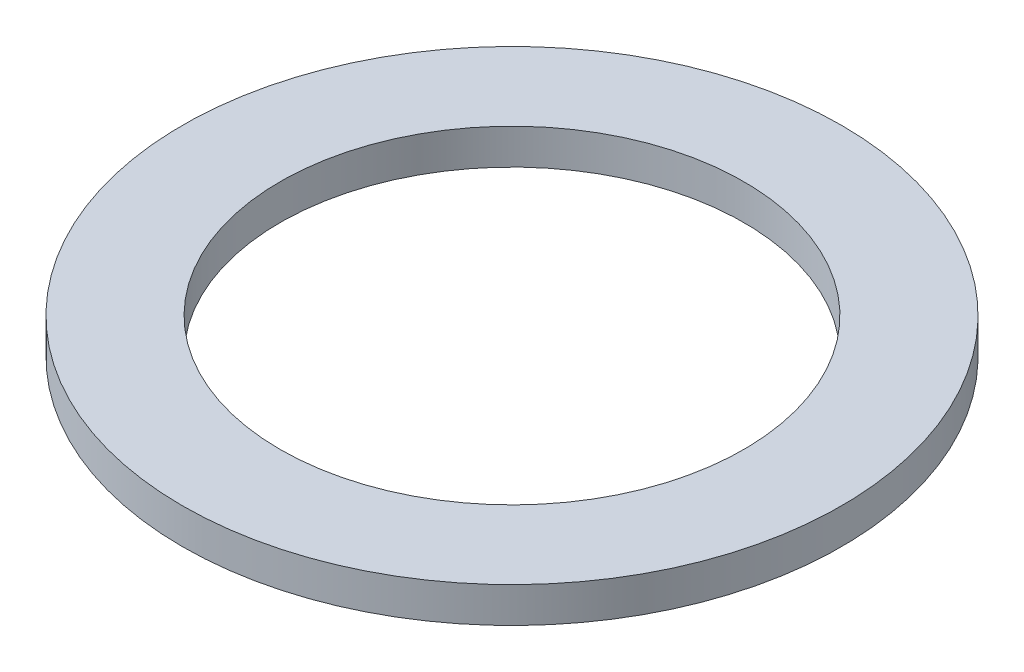
ISO-10303-21;
HEADER;
FILE_DESCRIPTION(('STEP AP214'),'2;1');
FILE_NAME('part.step','',(''),(''),'','','');
FILE_SCHEMA(('AUTOMOTIVE_DESIGN { 1 0 10303 214 1 1 1 1 }'));
ENDSEC;
DATA;
#1=APPLICATION_CONTEXT('core data for automotive mechanical design processes');
#2=APPLICATION_PROTOCOL_DEFINITION('international standard','automotive_design',2000,#1);
#3=PRODUCT_CONTEXT('',#1,'mechanical');
#4=PRODUCT('Part','Part','',(#3));
#5=PRODUCT_RELATED_PRODUCT_CATEGORY('part','',(#4));
#6=PRODUCT_DEFINITION_FORMATION('','',#4);
#7=PRODUCT_DEFINITION_CONTEXT('part definition',#1,'design');
#8=PRODUCT_DEFINITION('design','',#6,#7);
#9=PRODUCT_DEFINITION_SHAPE('','',#8);
#10=(LENGTH_UNIT() NAMED_UNIT(*) SI_UNIT(.MILLI.,.METRE.));
#11=(NAMED_UNIT(*) PLANE_ANGLE_UNIT() SI_UNIT($,.RADIAN.));
#12=(NAMED_UNIT(*) SI_UNIT($,.STERADIAN.) SOLID_ANGLE_UNIT());
#13=UNCERTAINTY_MEASURE_WITH_UNIT(LENGTH_MEASURE(1.E-05),#10,'distance_accuracy_value','');
#14=(GEOMETRIC_REPRESENTATION_CONTEXT(3) GLOBAL_UNCERTAINTY_ASSIGNED_CONTEXT((#13)) GLOBAL_UNIT_ASSIGNED_CONTEXT((#10,
#11,#12)) REPRESENTATION_CONTEXT('',''));
#15=CARTESIAN_POINT('',(0.,0.,0.));
#16=DIRECTION('',(0.,0.,1.));
#17=DIRECTION('',(1.,0.,0.));
#18=AXIS2_PLACEMENT_3D('',#15,#16,#17);
#19=CARTESIAN_POINT('',(0.,1.016,0.));
#20=DIRECTION('',(0.,1.,0.));
#21=DIRECTION('',(0.,0.,1.));
#22=AXIS2_PLACEMENT_3D('',#19,#20,#21);
#23=PLANE('',#22);
#24=CARTESIAN_POINT('',(0.,1.016,0.));
#25=DIRECTION('',(0.,1.,0.));
#26=DIRECTION('',(0.,0.,1.));
#27=AXIS2_PLACEMENT_3D('',#24,#25,#26);
#28=CIRCLE('',#27,9.45);
#29=CARTESIAN_POINT('',(0.,1.016,9.45));
#30=VERTEX_POINT('',#29);
#31=EDGE_CURVE('E10',#30,#30,#28,.T.);
#32=ORIENTED_EDGE('',*,*,#31,.T.);
#33=EDGE_LOOP('',(#32));
#34=FACE_BOUND('',#33,.T.);
#35=CARTESIAN_POINT('',(0.,1.016,0.));
#36=DIRECTION('',(0.,1.,0.));
#37=DIRECTION('',(0.,0.,1.));
#38=AXIS2_PLACEMENT_3D('',#35,#36,#37);
#39=CIRCLE('',#38,6.65);
#40=CARTESIAN_POINT('',(0.,1.016,6.65));
#41=VERTEX_POINT('',#40);
#42=EDGE_CURVE('E50',#41,#41,#39,.T.);
#43=ORIENTED_EDGE('',*,*,#42,.F.);
#44=EDGE_LOOP('',(#43));
#45=FACE_BOUND('',#44,.T.);
#46=ADVANCED_FACE('F37',(#34,#45),#23,.T.);
#47=CARTESIAN_POINT('',(0.,0.,0.));
#48=DIRECTION('',(0.,1.,0.));
#49=DIRECTION('',(0.,0.,1.));
#50=AXIS2_PLACEMENT_3D('',#47,#48,#49);
#51=PLANE('',#50);
#52=CARTESIAN_POINT('',(0.,0.,0.));
#53=DIRECTION('',(0.,1.,0.));
#54=DIRECTION('',(0.,0.,1.));
#55=AXIS2_PLACEMENT_3D('',#52,#53,#54);
#56=CIRCLE('',#55,9.45);
#57=CARTESIAN_POINT('',(0.,0.,9.45));
#58=VERTEX_POINT('',#57);
#59=EDGE_CURVE('E41',#58,#58,#56,.T.);
#60=ORIENTED_EDGE('',*,*,#59,.F.);
#61=EDGE_LOOP('',(#60));
#62=FACE_BOUND('',#61,.T.);
#63=CARTESIAN_POINT('',(0.,0.,0.));
#64=DIRECTION('',(0.,1.,0.));
#65=DIRECTION('',(0.,0.,1.));
#66=AXIS2_PLACEMENT_3D('',#63,#64,#65);
#67=CIRCLE('',#66,6.65);
#68=CARTESIAN_POINT('',(0.,0.,6.65));
#69=VERTEX_POINT('',#68);
#70=EDGE_CURVE('E52',#69,#69,#67,.T.);
#71=ORIENTED_EDGE('',*,*,#70,.T.);
#72=EDGE_LOOP('',(#71));
#73=FACE_BOUND('',#72,.T.);
#74=ADVANCED_FACE('F64',(#62,#73),#51,.F.);
#75=CARTESIAN_POINT('',(0.,1.016,0.));
#76=DIRECTION('',(0.,-1.,0.));
#77=DIRECTION('',(0.,0.,-1.));
#78=AXIS2_PLACEMENT_3D('',#75,#76,#77);
#79=CYLINDRICAL_SURFACE('',#78,9.45);
#80=ORIENTED_EDGE('',*,*,#31,.F.);
#81=EDGE_LOOP('',(#80));
#82=FACE_BOUND('',#81,.T.);
#83=ORIENTED_EDGE('',*,*,#59,.T.);
#84=EDGE_LOOP('',(#83));
#85=FACE_BOUND('',#84,.T.);
#86=ADVANCED_FACE('F39',(#82,#85),#79,.T.);
#87=CARTESIAN_POINT('',(0.,1.016,0.));
#88=DIRECTION('',(0.,-1.,0.));
#89=DIRECTION('',(0.,0.,-1.));
#90=AXIS2_PLACEMENT_3D('',#87,#88,#89);
#91=CYLINDRICAL_SURFACE('',#90,6.65);
#92=ORIENTED_EDGE('',*,*,#42,.T.);
#93=EDGE_LOOP('',(#92));
#94=FACE_BOUND('',#93,.T.);
#95=ORIENTED_EDGE('',*,*,#70,.F.);
#96=EDGE_LOOP('',(#95));
#97=FACE_BOUND('',#96,.T.);
#98=ADVANCED_FACE('F60',(#94,#97),#91,.F.);
#99=CLOSED_SHELL('',(#46,#74,#86,#98));
#100=MANIFOLD_SOLID_BREP('B2',#99);
#101=ADVANCED_BREP_SHAPE_REPRESENTATION('',(#18,#100),#14);
#102=SHAPE_DEFINITION_REPRESENTATION(#9,#101);
ENDSEC;
END-ISO-10303-21;
